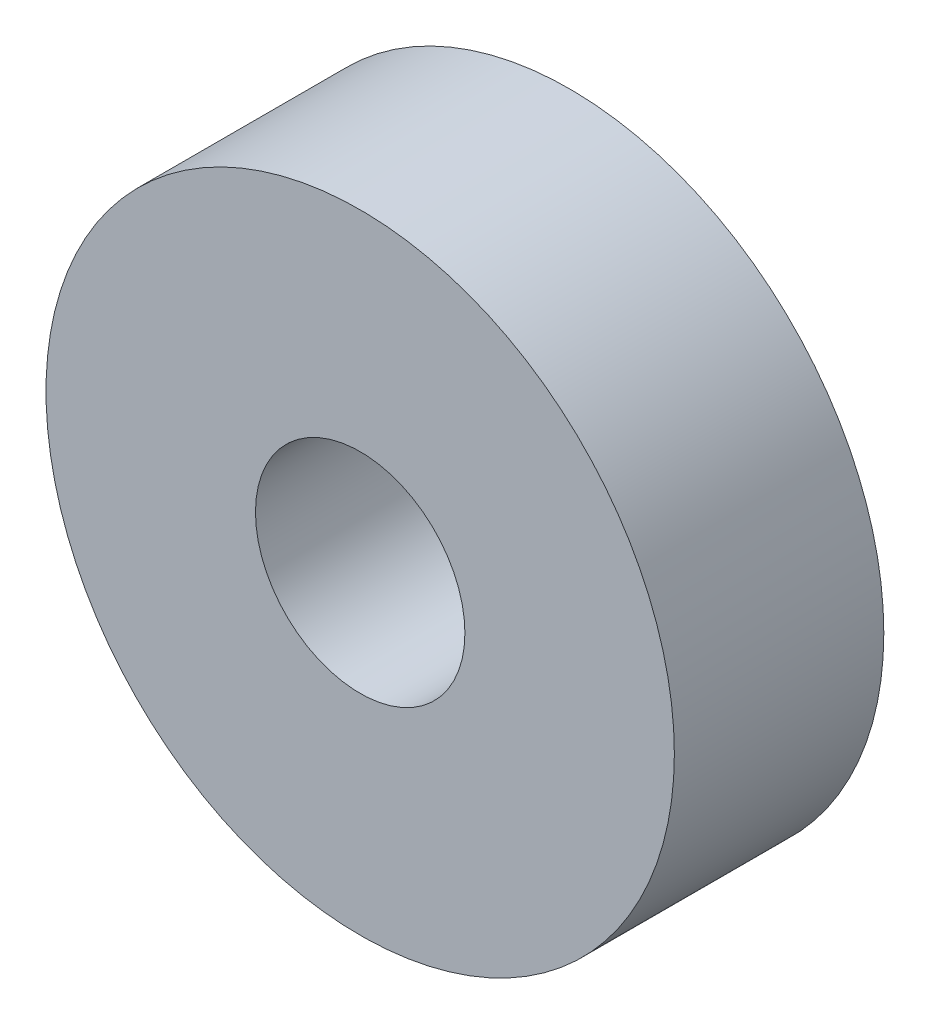
ISO-10303-21;
HEADER;
FILE_DESCRIPTION(('STEP AP214'),'2;1');
FILE_NAME('part.step','',(''),(''),'','','');
FILE_SCHEMA(('AUTOMOTIVE_DESIGN { 1 0 10303 214 1 1 1 1 }'));
ENDSEC;
DATA;
#1=APPLICATION_CONTEXT('core data for automotive mechanical design processes');
#2=APPLICATION_PROTOCOL_DEFINITION('international standard','automotive_design',2000,#1);
#3=PRODUCT_CONTEXT('',#1,'mechanical');
#4=PRODUCT('Part','Part','',(#3));
#5=PRODUCT_RELATED_PRODUCT_CATEGORY('part','',(#4));
#6=PRODUCT_DEFINITION_FORMATION('','',#4);
#7=PRODUCT_DEFINITION_CONTEXT('part definition',#1,'design');
#8=PRODUCT_DEFINITION('design','',#6,#7);
#9=PRODUCT_DEFINITION_SHAPE('','',#8);
#10=(LENGTH_UNIT() NAMED_UNIT(*) SI_UNIT(.MILLI.,.METRE.));
#11=(NAMED_UNIT(*) PLANE_ANGLE_UNIT() SI_UNIT($,.RADIAN.));
#12=(NAMED_UNIT(*) SI_UNIT($,.STERADIAN.) SOLID_ANGLE_UNIT());
#13=UNCERTAINTY_MEASURE_WITH_UNIT(LENGTH_MEASURE(1.E-05),#10,'distance_accuracy_value','');
#14=(GEOMETRIC_REPRESENTATION_CONTEXT(3) GLOBAL_UNCERTAINTY_ASSIGNED_CONTEXT((#13)) GLOBAL_UNIT_ASSIGNED_CONTEXT((#10,
#11,#12)) REPRESENTATION_CONTEXT('',''));
#15=CARTESIAN_POINT('',(0.,0.,0.));
#16=DIRECTION('',(0.,0.,1.));
#17=DIRECTION('',(1.,0.,0.));
#18=AXIS2_PLACEMENT_3D('',#15,#16,#17);
#19=CARTESIAN_POINT('',(0.,0.,25.4));
#20=DIRECTION('',(0.,0.,1.));
#21=DIRECTION('',(1.,0.,0.));
#22=AXIS2_PLACEMENT_3D('',#19,#20,#21);
#23=PLANE('',#22);
#24=CARTESIAN_POINT('',(0.,0.,25.4));
#25=DIRECTION('',(0.,0.,1.));
#26=DIRECTION('',(1.,0.,0.));
#27=AXIS2_PLACEMENT_3D('',#24,#25,#26);
#28=CIRCLE('',#27,38.1);
#29=CARTESIAN_POINT('',(38.1,0.,25.4));
#30=VERTEX_POINT('',#29);
#31=EDGE_CURVE('E10',#30,#30,#28,.T.);
#32=ORIENTED_EDGE('',*,*,#31,.T.);
#33=EDGE_LOOP('',(#32));
#34=FACE_BOUND('',#33,.T.);
#35=CARTESIAN_POINT('',(0.,0.,25.4));
#36=DIRECTION('',(0.,0.,1.));
#37=DIRECTION('',(1.,0.,0.));
#38=AXIS2_PLACEMENT_3D('',#35,#36,#37);
#39=CIRCLE('',#38,12.7);
#40=CARTESIAN_POINT('',(12.7,0.,25.4));
#41=VERTEX_POINT('',#40);
#42=EDGE_CURVE('E50',#41,#41,#39,.T.);
#43=ORIENTED_EDGE('',*,*,#42,.F.);
#44=EDGE_LOOP('',(#43));
#45=FACE_BOUND('',#44,.T.);
#46=ADVANCED_FACE('F39',(#34,#45),#23,.T.);
#47=CARTESIAN_POINT('',(0.,0.,0.));
#48=DIRECTION('',(0.,0.,1.));
#49=DIRECTION('',(1.,0.,0.));
#50=AXIS2_PLACEMENT_3D('',#47,#48,#49);
#51=PLANE('',#50);
#52=CARTESIAN_POINT('',(0.,0.,0.));
#53=DIRECTION('',(0.,0.,1.));
#54=DIRECTION('',(1.,0.,0.));
#55=AXIS2_PLACEMENT_3D('',#52,#53,#54);
#56=CIRCLE('',#55,38.1);
#57=CARTESIAN_POINT('',(38.1,0.,0.));
#58=VERTEX_POINT('',#57);
#59=EDGE_CURVE('E43',#58,#58,#56,.T.);
#60=ORIENTED_EDGE('',*,*,#59,.F.);
#61=EDGE_LOOP('',(#60));
#62=FACE_BOUND('',#61,.T.);
#63=CARTESIAN_POINT('',(0.,0.,0.));
#64=DIRECTION('',(0.,0.,1.));
#65=DIRECTION('',(1.,0.,0.));
#66=AXIS2_PLACEMENT_3D('',#63,#64,#65);
#67=CIRCLE('',#66,12.7);
#68=CARTESIAN_POINT('',(12.7,0.,0.));
#69=VERTEX_POINT('',#68);
#70=EDGE_CURVE('E52',#69,#69,#67,.T.);
#71=ORIENTED_EDGE('',*,*,#70,.T.);
#72=EDGE_LOOP('',(#71));
#73=FACE_BOUND('',#72,.T.);
#74=ADVANCED_FACE('F62',(#62,#73),#51,.F.);
#75=CARTESIAN_POINT('',(0.,0.,25.4));
#76=DIRECTION('',(0.,0.,-1.));
#77=DIRECTION('',(-1.,0.,0.));
#78=AXIS2_PLACEMENT_3D('',#75,#76,#77);
#79=CYLINDRICAL_SURFACE('',#78,38.1);
#80=ORIENTED_EDGE('',*,*,#31,.F.);
#81=EDGE_LOOP('',(#80));
#82=FACE_BOUND('',#81,.T.);
#83=ORIENTED_EDGE('',*,*,#59,.T.);
#84=EDGE_LOOP('',(#83));
#85=FACE_BOUND('',#84,.T.);
#86=ADVANCED_FACE('F41',(#82,#85),#79,.T.);
#87=CARTESIAN_POINT('',(0.,0.,25.4));
#88=DIRECTION('',(0.,0.,-1.));
#89=DIRECTION('',(-1.,0.,0.));
#90=AXIS2_PLACEMENT_3D('',#87,#88,#89);
#91=CYLINDRICAL_SURFACE('',#90,12.7);
#92=ORIENTED_EDGE('',*,*,#42,.T.);
#93=EDGE_LOOP('',(#92));
#94=FACE_BOUND('',#93,.T.);
#95=ORIENTED_EDGE('',*,*,#70,.F.);
#96=EDGE_LOOP('',(#95));
#97=FACE_BOUND('',#96,.T.);
#98=ADVANCED_FACE('F58',(#94,#97),#91,.F.);
#99=CLOSED_SHELL('',(#46,#74,#86,#98));
#100=MANIFOLD_SOLID_BREP('B2',#99);
#101=ADVANCED_BREP_SHAPE_REPRESENTATION('',(#18,#100),#14);
#102=SHAPE_DEFINITION_REPRESENTATION(#9,#101);
ENDSEC;
END-ISO-10303-21;
